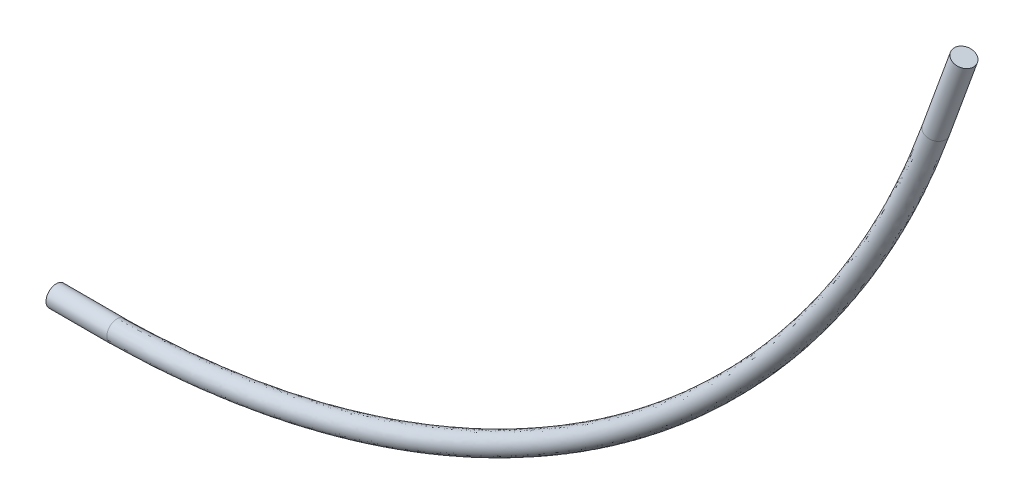
ISO-10303-21;
HEADER;
FILE_DESCRIPTION(('STEP AP214'),'2;1');
FILE_NAME('part.step','',(''),(''),'','','');
FILE_SCHEMA(('AUTOMOTIVE_DESIGN { 1 0 10303 214 1 1 1 1 }'));
ENDSEC;
DATA;
#1=APPLICATION_CONTEXT('core data for automotive mechanical design processes');
#2=APPLICATION_PROTOCOL_DEFINITION('international standard','automotive_design',2000,#1);
#3=PRODUCT_CONTEXT('',#1,'mechanical');
#4=PRODUCT('Part','Part','',(#3));
#5=PRODUCT_RELATED_PRODUCT_CATEGORY('part','',(#4));
#6=PRODUCT_DEFINITION_FORMATION('','',#4);
#7=PRODUCT_DEFINITION_CONTEXT('part definition',#1,'design');
#8=PRODUCT_DEFINITION('design','',#6,#7);
#9=PRODUCT_DEFINITION_SHAPE('','',#8);
#10=(LENGTH_UNIT() NAMED_UNIT(*) SI_UNIT(.MILLI.,.METRE.));
#11=(NAMED_UNIT(*) PLANE_ANGLE_UNIT() SI_UNIT($,.RADIAN.));
#12=(NAMED_UNIT(*) SI_UNIT($,.STERADIAN.) SOLID_ANGLE_UNIT());
#13=UNCERTAINTY_MEASURE_WITH_UNIT(LENGTH_MEASURE(1.E-05),#10,'distance_accuracy_value','');
#14=(GEOMETRIC_REPRESENTATION_CONTEXT(3) GLOBAL_UNCERTAINTY_ASSIGNED_CONTEXT((#13)) GLOBAL_UNIT_ASSIGNED_CONTEXT((#10,
#11,#12)) REPRESENTATION_CONTEXT('',''));
#15=CARTESIAN_POINT('',(0.,0.,0.));
#16=DIRECTION('',(0.,0.,1.));
#17=DIRECTION('',(1.,0.,0.));
#18=AXIS2_PLACEMENT_3D('',#15,#16,#17);
#19=CARTESIAN_POINT('',(0.,0.,0.));
#20=DIRECTION('',(1.,0.,0.));
#21=DIRECTION('',(0.,0.,-1.));
#22=AXIS2_PLACEMENT_3D('',#19,#20,#21);
#23=PLANE('',#22);
#24=CARTESIAN_POINT('',(0.,0.,0.));
#25=DIRECTION('',(1.,0.,0.));
#26=DIRECTION('',(0.,0.,-1.));
#27=AXIS2_PLACEMENT_3D('',#24,#25,#26);
#28=CIRCLE('',#27,3.175);
#29=CARTESIAN_POINT('',(0.,0.,-3.175));
#30=VERTEX_POINT('',#29);
#31=EDGE_CURVE('E48',#30,#30,#28,.T.);
#32=ORIENTED_EDGE('',*,*,#31,.F.);
#33=EDGE_LOOP('',(#32));
#34=FACE_BOUND('',#33,.T.);
#35=ADVANCED_FACE('F35',(#34),#23,.F.);
#36=CARTESIAN_POINT('',(280.994977572228,204.375656359263,0.));
#37=DIRECTION('',(0.342020143325666,0.939692620785909,0.));
#38=DIRECTION('',(0.,0.,-1.));
#39=AXIS2_PLACEMENT_3D('',#36,#37,#38);
#40=PLANE('',#39);
#41=CARTESIAN_POINT('',(280.994977572228,204.375656359263,0.));
#42=DIRECTION('',(0.342020143325666,0.939692620785909,0.));
#43=DIRECTION('',(0.,0.,-1.));
#44=AXIS2_PLACEMENT_3D('',#41,#42,#43);
#45=CIRCLE('',#44,3.175);
#46=CARTESIAN_POINT('',(280.994977572228,204.375656359263,-3.175));
#47=VERTEX_POINT('',#46);
#48=EDGE_CURVE('E53',#47,#47,#45,.T.);
#49=ORIENTED_EDGE('',*,*,#48,.T.);
#50=EDGE_LOOP('',(#49));
#51=FACE_BOUND('',#50,.T.);
#52=ADVANCED_FACE('F90',(#51),#40,.T.);
#53=CARTESIAN_POINT('',(19.25,0.,0.));
#54=DIRECTION('',(-1.,0.,0.));
#55=DIRECTION('',(0.,-1.,0.));
#56=AXIS2_PLACEMENT_3D('',#53,#54,#55);
#57=CYLINDRICAL_SURFACE('',#56,3.175);
#58=ORIENTED_EDGE('',*,*,#31,.T.);
#59=EDGE_LOOP('',(#58));
#60=FACE_BOUND('',#59,.T.);
#61=CARTESIAN_POINT('',(18.8500279655135,-0.00334446158616642,0.));
#62=DIRECTION('',(0.999860172432862,0.0167223079306566,0.));
#63=DIRECTION('',(0.,0.,-1.));
#64=AXIS2_PLACEMENT_3D('',#61,#62,#63);
#65=CIRCLE('',#64,3.175);
#66=CARTESIAN_POINT('',(18.8500279655101,-0.00334446076155695,-3.17499941283916));
#67=VERTEX_POINT('',#66);
#68=EDGE_CURVE('E11',#67,#67,#65,.T.);
#69=ORIENTED_EDGE('',*,*,#68,.F.);
#70=EDGE_LOOP('',(#69));
#71=FACE_BOUND('',#70,.T.);
#72=ADVANCED_FACE('F82',(#60,#71),#57,.T.);
#73=CARTESIAN_POINT('',(280.994977572228,204.375656359263,0.));
#74=DIRECTION('',(-0.342020143325667,-0.939692620785909,0.));
#75=DIRECTION('',(0.939692620785909,-0.342020143325667,0.));
#76=AXIS2_PLACEMENT_3D('',#73,#74,#75);
#77=CYLINDRICAL_SURFACE('',#76,3.175);
#78=CARTESIAN_POINT('',(272.307665931757,180.507463791301,0.));
#79=DIRECTION('',(0.342020143325666,0.939692620785909,0.));
#80=DIRECTION('',(0.,0.,-1.));
#81=AXIS2_PLACEMENT_3D('',#78,#79,#80);
#82=CIRCLE('',#81,3.175);
#83=CARTESIAN_POINT('',(272.307665931757,180.507463791301,-3.175));
#84=VERTEX_POINT('',#83);
#85=EDGE_CURVE('E43',#84,#84,#82,.T.);
#86=ORIENTED_EDGE('',*,*,#85,.T.);
#87=EDGE_LOOP('',(#86));
#88=FACE_BOUND('',#87,.T.);
#89=ORIENTED_EDGE('',*,*,#48,.F.);
#90=EDGE_LOOP('',(#89));
#91=FACE_BOUND('',#90,.T.);
#92=ADVANCED_FACE('F81',(#88,#91),#77,.T.);
#93=CARTESIAN_POINT('',(272.307665931757,180.507463791301,-3.175));
#94=CARTESIAN_POINT('',(271.718666285876,178.889200564178,-3.175));
#95=CARTESIAN_POINT('',(271.114436661159,177.276495968376,-3.175));
#96=CARTESIAN_POINT('',(269.8757261064,174.062757795169,-3.175));
#97=CARTESIAN_POINT('',(269.241245170677,172.461724255552,-3.175));
#98=CARTESIAN_POINT('',(267.292756021953,167.676963702438,-3.175));
#99=CARTESIAN_POINT('',(265.933695507858,164.511577066203,-3.175));
#100=CARTESIAN_POINT('',(261.679169841282,155.095452835661,-3.175));
#101=CARTESIAN_POINT('',(258.606270377996,148.924783875201,-3.175));
#102=CARTESIAN_POINT('',(248.704152788701,130.785793029956,-3.175));
#103=CARTESIAN_POINT('',(241.190587340439,119.191751591583,-3.175));
#104=CARTESIAN_POINT('',(216.167252314814,86.2968605469632,-3.175));
#105=CARTESIAN_POINT('',(196.159338149794,66.901537100209,-3.175));
#106=CARTESIAN_POINT('',(151.283516085206,34.916638255658,-3.175));
#107=CARTESIAN_POINT('',(126.421741378737,22.3314342488983,-3.175));
#108=CARTESIAN_POINT('',(87.1627638109094,9.40959879121987,-3.175));
#109=CARTESIAN_POINT('',(73.7521876208226,6.08992762666343,-3.175));
#110=CARTESIAN_POINT('',(53.3754325710943,2.64765481169502,-3.175));
#111=CARTESIAN_POINT('',(46.5399185328455,1.75611896661112,-3.175));
#112=CARTESIAN_POINT('',(36.250847929869,0.806450722854175,-3.175));
#113=CARTESIAN_POINT('',(32.8151915620155,0.554476958328467,-3.175));
#114=CARTESIAN_POINT('',(27.6563633259304,0.273657823456547,-3.175));
#115=CARTESIAN_POINT('',(25.9358628942269,0.196240288026011,-3.175));
#116=CARTESIAN_POINT('',(22.4936746473334,0.0738111957894119,-3.175));
#117=CARTESIAN_POINT('',(20.7719868362972,0.0288011904348096,-3.175));
#118=CARTESIAN_POINT('',(18.9833426562944,-0.0011148812578258,-3.175));
#119=CARTESIAN_POINT('',(18.9166853103423,-0.00222964105745817,-3.175));
#120=CARTESIAN_POINT('',(18.8500279655135,-0.00334446158616642,-3.175));
#121=CARTESIAN_POINT('',(266.340617789766,182.679291701419,-3.175));
#122=CARTESIAN_POINT('',(265.758433426905,181.079753310498,-3.175));
#123=CARTESIAN_POINT('',(265.175002101774,179.523094586055,-3.175));
#124=CARTESIAN_POINT('',(263.964957652553,176.383728393732,-3.175));
#125=CARTESIAN_POINT('',(263.345159805972,174.819745798949,-3.175));
#126=CARTESIAN_POINT('',(261.441762382144,170.145713656556,-3.175));
#127=CARTESIAN_POINT('',(260.114153099334,167.053580055174,-3.175));
#128=CARTESIAN_POINT('',(255.958085205188,157.855362752104,-3.175));
#129=CARTESIAN_POINT('',(252.9562984486,151.827494744718,-3.175));
#130=CARTESIAN_POINT('',(243.283334592407,134.108274461815,-3.175));
#131=CARTESIAN_POINT('',(235.943647262351,122.782541075218,-3.175));
#132=CARTESIAN_POINT('',(211.49939954691,90.6489000378737,-3.175));
#133=CARTESIAN_POINT('',(191.954506365599,71.7024210665132,-3.175));
#134=CARTESIAN_POINT('',(148.117195716271,40.4577132882775,-3.175));
#135=CARTESIAN_POINT('',(123.830769508819,28.1637547101178,-3.175));
#136=CARTESIAN_POINT('',(85.480318949474,15.5409549696522,-3.175));
#137=CARTESIAN_POINT('',(72.3800888617454,12.2981072757832,-3.175));
#138=CARTESIAN_POINT('',(52.4748904713406,8.93549516563612,-3.175));
#139=CARTESIAN_POINT('',(45.7975631589156,8.06459114655272,-3.175));
#140=CARTESIAN_POINT('',(35.7466011139349,7.13690002248507,-3.175));
#141=CARTESIAN_POINT('',(32.3904523337838,6.89075740753601,-3.175));
#142=CARTESIAN_POINT('',(27.3510091422307,6.61643695868206,-3.175));
#143=CARTESIAN_POINT('',(25.6703243452519,6.54081101147464,-3.175));
#144=CARTESIAN_POINT('',(22.3077948461061,6.42121516003618,-3.175));
#145=CARTESIAN_POINT('',(20.6458751648049,6.37758001021325,-3.175));
#146=CARTESIAN_POINT('',(18.8779272894374,6.34801011462429,-3.175));
#147=CARTESIAN_POINT('',(18.8104986549826,6.34688245389121,-3.175));
#148=CARTESIAN_POINT('',(18.7438413101539,6.34576763336251,-3.175));
#149=CARTESIAN_POINT('',(266.340617789766,182.679291701419,3.175));
#150=CARTESIAN_POINT('',(265.758433426905,181.079753310498,3.175));
#151=CARTESIAN_POINT('',(265.175002101774,179.523094586055,3.175));
#152=CARTESIAN_POINT('',(263.964957652553,176.383728393732,3.175));
#153=CARTESIAN_POINT('',(263.345159805972,174.819745798949,3.175));
#154=CARTESIAN_POINT('',(261.441762382144,170.145713656556,3.175));
#155=CARTESIAN_POINT('',(260.114153099334,167.053580055174,3.175));
#156=CARTESIAN_POINT('',(255.958085205188,157.855362752104,3.175));
#157=CARTESIAN_POINT('',(252.9562984486,151.827494744718,3.175));
#158=CARTESIAN_POINT('',(243.283334592407,134.108274461815,3.175));
#159=CARTESIAN_POINT('',(235.943647262351,122.782541075218,3.175));
#160=CARTESIAN_POINT('',(211.49939954691,90.6489000378737,3.175));
#161=CARTESIAN_POINT('',(191.954506365599,71.7024210665132,3.175));
#162=CARTESIAN_POINT('',(148.117195716271,40.4577132882775,3.175));
#163=CARTESIAN_POINT('',(123.830769508819,28.1637547101178,3.175));
#164=CARTESIAN_POINT('',(85.480318949474,15.5409549696522,3.175));
#165=CARTESIAN_POINT('',(72.3800888617454,12.2981072757832,3.175));
#166=CARTESIAN_POINT('',(52.4748904713406,8.93549516563612,3.175));
#167=CARTESIAN_POINT('',(45.7975631589156,8.06459114655272,3.175));
#168=CARTESIAN_POINT('',(35.7466011139349,7.13690002248507,3.175));
#169=CARTESIAN_POINT('',(32.3904523337838,6.89075740753601,3.175));
#170=CARTESIAN_POINT('',(27.3510091422307,6.61643695868206,3.175));
#171=CARTESIAN_POINT('',(25.6703243452519,6.54081101147464,3.175));
#172=CARTESIAN_POINT('',(22.3077948461061,6.42121516003618,3.175));
#173=CARTESIAN_POINT('',(20.6458751648049,6.37758001021325,3.175));
#174=CARTESIAN_POINT('',(18.8779272894374,6.34801011462429,3.175));
#175=CARTESIAN_POINT('',(18.8104986549826,6.34688245389121,3.175));
#176=CARTESIAN_POINT('',(18.7438413101539,6.34576763336251,3.175));
#177=CARTESIAN_POINT('',(272.307665931757,180.507463791301,3.175));
#178=CARTESIAN_POINT('',(271.718666285876,178.889200564178,3.175));
#179=CARTESIAN_POINT('',(271.114436661159,177.276495968376,3.175));
#180=CARTESIAN_POINT('',(269.8757261064,174.062757795169,3.175));
#181=CARTESIAN_POINT('',(269.241245170677,172.461724255552,3.175));
#182=CARTESIAN_POINT('',(267.292756021953,167.676963702438,3.175));
#183=CARTESIAN_POINT('',(265.933695507858,164.511577066203,3.175));
#184=CARTESIAN_POINT('',(261.679169841282,155.095452835661,3.175));
#185=CARTESIAN_POINT('',(258.606270377996,148.924783875201,3.175));
#186=CARTESIAN_POINT('',(248.704152788701,130.785793029956,3.175));
#187=CARTESIAN_POINT('',(241.190587340439,119.191751591583,3.175));
#188=CARTESIAN_POINT('',(216.167252314814,86.2968605469632,3.175));
#189=CARTESIAN_POINT('',(196.159338149794,66.901537100209,3.175));
#190=CARTESIAN_POINT('',(151.283516085206,34.916638255658,3.175));
#191=CARTESIAN_POINT('',(126.421741378737,22.3314342488983,3.175));
#192=CARTESIAN_POINT('',(87.1627638109094,9.40959879121987,3.175));
#193=CARTESIAN_POINT('',(73.7521876208226,6.08992762666343,3.175));
#194=CARTESIAN_POINT('',(53.3754325710943,2.64765481169503,3.175));
#195=CARTESIAN_POINT('',(46.5399185328455,1.75611896661112,3.175));
#196=CARTESIAN_POINT('',(36.250847929869,0.806450722854175,3.175));
#197=CARTESIAN_POINT('',(32.8151915620155,0.554476958328468,3.175));
#198=CARTESIAN_POINT('',(27.6563633259304,0.273657823456547,3.175));
#199=CARTESIAN_POINT('',(25.9358628942269,0.196240288026011,3.175));
#200=CARTESIAN_POINT('',(22.4936746473334,0.0738111957894123,3.175));
#201=CARTESIAN_POINT('',(20.7719868362972,0.02880119043481,3.175));
#202=CARTESIAN_POINT('',(18.9833426562944,-0.00111488125782541,3.175));
#203=CARTESIAN_POINT('',(18.9166853103423,-0.00222964105745778,3.175));
#204=CARTESIAN_POINT('',(18.8500279655135,-0.00334446158616603,3.175));
#205=CARTESIAN_POINT('',(278.274714073747,178.335635881183,3.175));
#206=CARTESIAN_POINT('',(277.678899144847,176.698647817857,3.175));
#207=CARTESIAN_POINT('',(277.053871220545,175.029897350698,3.175));
#208=CARTESIAN_POINT('',(275.786494560248,171.741787196605,3.175));
#209=CARTESIAN_POINT('',(275.137330535383,170.103702712156,3.175));
#210=CARTESIAN_POINT('',(273.143749661761,165.208213748319,3.175));
#211=CARTESIAN_POINT('',(271.753237916382,161.969574077232,3.175));
#212=CARTESIAN_POINT('',(267.400254477376,152.335542919218,3.175));
#213=CARTESIAN_POINT('',(264.256242307391,146.022073005683,3.175));
#214=CARTESIAN_POINT('',(254.124970984996,127.463311598098,3.175));
#215=CARTESIAN_POINT('',(246.437527418527,115.600962107948,3.175));
#216=CARTESIAN_POINT('',(220.835105082717,81.9448210560527,3.175));
#217=CARTESIAN_POINT('',(200.364169933989,62.1006531339049,3.175));
#218=CARTESIAN_POINT('',(154.44983645414,29.3755632230385,3.175));
#219=CARTESIAN_POINT('',(129.012713248655,16.4991137876789,3.175));
#220=CARTESIAN_POINT('',(88.8452086723447,3.27824261278752,3.175));
#221=CARTESIAN_POINT('',(75.1242863798998,-0.118252022456297,3.175));
#222=CARTESIAN_POINT('',(54.275974670848,-3.64018554224607,3.175));
#223=CARTESIAN_POINT('',(47.2822739067755,-4.55235321333049,3.175));
#224=CARTESIAN_POINT('',(36.7550947458031,-5.52399857677672,3.175));
#225=CARTESIAN_POINT('',(33.2399307902472,-5.78180349087907,3.175));
#226=CARTESIAN_POINT('',(27.9617175096302,-6.06912131176896,3.175));
#227=CARTESIAN_POINT('',(26.201401443202,-6.14833043542261,3.175));
#228=CARTESIAN_POINT('',(22.6795544485607,-6.27359276845735,3.175));
#229=CARTESIAN_POINT('',(20.8980985077895,-6.31997762934363,3.175));
#230=CARTESIAN_POINT('',(19.0887580231513,-6.35023987713994,3.175));
#231=CARTESIAN_POINT('',(19.022871965702,-6.35134173600613,3.175));
#232=CARTESIAN_POINT('',(18.9562146208732,-6.35245655653484,3.175));
#233=CARTESIAN_POINT('',(278.274714073747,178.335635881183,-3.175));
#234=CARTESIAN_POINT('',(277.678899144847,176.698647817857,-3.175));
#235=CARTESIAN_POINT('',(277.053871220545,175.029897350698,-3.175));
#236=CARTESIAN_POINT('',(275.786494560248,171.741787196605,-3.175));
#237=CARTESIAN_POINT('',(275.137330535383,170.103702712156,-3.175));
#238=CARTESIAN_POINT('',(273.143749661761,165.208213748319,-3.175));
#239=CARTESIAN_POINT('',(271.753237916382,161.969574077232,-3.175));
#240=CARTESIAN_POINT('',(267.400254477376,152.335542919218,-3.175));
#241=CARTESIAN_POINT('',(264.256242307391,146.022073005683,-3.175));
#242=CARTESIAN_POINT('',(254.124970984996,127.463311598098,-3.175));
#243=CARTESIAN_POINT('',(246.437527418527,115.600962107948,-3.175));
#244=CARTESIAN_POINT('',(220.835105082717,81.9448210560527,-3.175));
#245=CARTESIAN_POINT('',(200.364169933989,62.1006531339049,-3.175));
#246=CARTESIAN_POINT('',(154.44983645414,29.3755632230385,-3.175));
#247=CARTESIAN_POINT('',(129.012713248655,16.4991137876789,-3.175));
#248=CARTESIAN_POINT('',(88.8452086723447,3.27824261278752,-3.175));
#249=CARTESIAN_POINT('',(75.1242863798998,-0.118252022456297,-3.175));
#250=CARTESIAN_POINT('',(54.275974670848,-3.64018554224607,-3.175));
#251=CARTESIAN_POINT('',(47.2822739067755,-4.55235321333049,-3.175));
#252=CARTESIAN_POINT('',(36.7550947458031,-5.52399857677672,-3.175));
#253=CARTESIAN_POINT('',(33.2399307902472,-5.78180349087907,-3.175));
#254=CARTESIAN_POINT('',(27.9617175096302,-6.06912131176896,-3.175));
#255=CARTESIAN_POINT('',(26.201401443202,-6.14833043542261,-3.175));
#256=CARTESIAN_POINT('',(22.6795544485607,-6.27359276845735,-3.175));
#257=CARTESIAN_POINT('',(20.8980985077895,-6.31997762934363,-3.175));
#258=CARTESIAN_POINT('',(19.0887580231513,-6.35023987713994,-3.175));
#259=CARTESIAN_POINT('',(19.022871965702,-6.35134173600613,-3.175));
#260=CARTESIAN_POINT('',(18.9562146208732,-6.35245655653484,-3.175));
#261=CARTESIAN_POINT('',(272.307665931757,180.507463791301,-3.175));
#262=CARTESIAN_POINT('',(271.718666285876,178.889200564178,-3.175));
#263=CARTESIAN_POINT('',(271.114436661159,177.276495968376,-3.175));
#264=CARTESIAN_POINT('',(269.8757261064,174.062757795169,-3.175));
#265=CARTESIAN_POINT('',(269.241245170677,172.461724255552,-3.175));
#266=CARTESIAN_POINT('',(267.292756021953,167.676963702438,-3.175));
#267=CARTESIAN_POINT('',(265.933695507858,164.511577066203,-3.175));
#268=CARTESIAN_POINT('',(261.679169841282,155.095452835661,-3.175));
#269=CARTESIAN_POINT('',(258.606270377996,148.924783875201,-3.175));
#270=CARTESIAN_POINT('',(248.704152788701,130.785793029956,-3.175));
#271=CARTESIAN_POINT('',(241.190587340439,119.191751591583,-3.175));
#272=CARTESIAN_POINT('',(216.167252314814,86.2968605469632,-3.175));
#273=CARTESIAN_POINT('',(196.159338149794,66.901537100209,-3.175));
#274=CARTESIAN_POINT('',(151.283516085206,34.916638255658,-3.175));
#275=CARTESIAN_POINT('',(126.421741378737,22.3314342488983,-3.175));
#276=CARTESIAN_POINT('',(87.1627638109094,9.40959879121987,-3.175));
#277=CARTESIAN_POINT('',(73.7521876208226,6.08992762666343,-3.175));
#278=CARTESIAN_POINT('',(53.3754325710943,2.64765481169502,-3.175));
#279=CARTESIAN_POINT('',(46.5399185328455,1.75611896661112,-3.175));
#280=CARTESIAN_POINT('',(36.250847929869,0.806450722854175,-3.175));
#281=CARTESIAN_POINT('',(32.8151915620155,0.554476958328467,-3.175));
#282=CARTESIAN_POINT('',(27.6563633259304,0.273657823456547,-3.175));
#283=CARTESIAN_POINT('',(25.9358628942269,0.196240288026011,-3.175));
#284=CARTESIAN_POINT('',(22.4936746473334,0.0738111957894119,-3.175));
#285=CARTESIAN_POINT('',(20.7719868362972,0.0288011904348096,-3.175));
#286=CARTESIAN_POINT('',(18.9833426562944,-0.0011148812578258,-3.175));
#287=CARTESIAN_POINT('',(18.9166853103423,-0.00222964105745817,-3.175));
#288=CARTESIAN_POINT('',(18.8500279655135,-0.00334446158616642,-3.175));
#289=(BOUNDED_SURFACE() B_SPLINE_SURFACE(3,3,((#93,#94,#95,#96,#97,#98,#99,#100,#101,#102,#103,
#104,#105,#106,#107,#108,#109,#110,#111,#112,#113,#114,#115,#116,#117,#118,#119,#120),(#121,
#122,#123,#124,#125,#126,#127,#128,#129,#130,#131,#132,#133,#134,#135,#136,#137,#138,#139,#140,
#141,#142,#143,#144,#145,#146,#147,#148),(#149,#150,#151,#152,#153,#154,#155,#156,#157,#158,
#159,#160,#161,#162,#163,#164,#165,#166,#167,#168,#169,#170,#171,#172,#173,#174,#175,#176),
(#177,#178,#179,#180,#181,#182,#183,#184,#185,#186,#187,#188,#189,#190,#191,#192,#193,#194,#195,
#196,#197,#198,#199,#200,#201,#202,#203,#204),(#205,#206,#207,#208,#209,#210,#211,#212,#213,
#214,#215,#216,#217,#218,#219,#220,#221,#222,#223,#224,#225,#226,#227,#228,#229,#230,#231,#232),
(#233,#234,#235,#236,#237,#238,#239,#240,#241,#242,#243,#244,#245,#246,#247,#248,#249,#250,#251,
#252,#253,#254,#255,#256,#257,#258,#259,#260),(#261,#262,#263,#264,#265,#266,#267,#268,#269,
#270,#271,#272,#273,#274,#275,#276,#277,#278,#279,#280,#281,#282,#283,#284,#285,#286,#287,
#288)),.UNSPECIFIED.,.T.,.F.,.F.) B_SPLINE_SURFACE_WITH_KNOTS((4,3,4),(4,2,2,2,2,2,2,2,2,2,2,2,
2,4),(0.,0.5,1.),(0.0713388976291008,0.0858492273536461,0.100359557078191,0.129380216527282,
0.187421535425463,0.303504173221826,0.53566944881455,0.767834724407275,0.883917362203638,
0.941958681101819,0.970979340550909,0.985489670275455,1.,1.00056168840281),
.UNSPECIFIED.) GEOMETRIC_REPRESENTATION_ITEM() RATIONAL_B_SPLINE_SURFACE(((1.,1.,1.,1.,1.,1.,1.,
1.,1.,1.,1.,1.,1.,1.,1.,1.,1.,1.,1.,1.,1.,1.,1.,1.,1.,1.,1.,1.),(0.333333333333333,
0.333333333333333,0.333333333333333,0.333333333333333,0.333333333333333,0.333333333333333,
0.333333333333333,0.333333333333333,0.333333333333333,0.333333333333333,0.333333333333333,
0.333333333333333,0.333333333333333,0.333333333333333,0.333333333333333,0.333333333333333,
0.333333333333333,0.333333333333333,0.333333333333333,0.333333333333333,0.333333333333333,
0.333333333333333,0.333333333333333,0.333333333333333,0.333333333333333,0.333333333333333,
0.333333333333333,0.333333333333333),(0.333333333333333,0.333333333333333,0.333333333333333,
0.333333333333333,0.333333333333333,0.333333333333333,0.333333333333333,0.333333333333333,
0.333333333333333,0.333333333333333,0.333333333333333,0.333333333333333,0.333333333333333,
0.333333333333333,0.333333333333333,0.333333333333333,0.333333333333333,0.333333333333333,
0.333333333333333,0.333333333333333,0.333333333333333,0.333333333333333,0.333333333333333,
0.333333333333333,0.333333333333333,0.333333333333333,0.333333333333333,0.333333333333333),(1.,
1.,1.,1.,1.,1.,1.,1.,1.,1.,1.,1.,1.,1.,1.,1.,1.,1.,1.,1.,1.,1.,1.,1.,1.,1.,1.,1.),
(0.333333333333333,0.333333333333333,0.333333333333333,0.333333333333333,0.333333333333333,
0.333333333333333,0.333333333333333,0.333333333333333,0.333333333333333,0.333333333333333,
0.333333333333333,0.333333333333333,0.333333333333333,0.333333333333333,0.333333333333333,
0.333333333333333,0.333333333333333,0.333333333333333,0.333333333333333,0.333333333333333,
0.333333333333333,0.333333333333333,0.333333333333333,0.333333333333333,0.333333333333333,
0.333333333333333,0.333333333333333,0.333333333333333),(0.333333333333333,0.333333333333333,
0.333333333333333,0.333333333333333,0.333333333333333,0.333333333333333,0.333333333333333,
0.333333333333333,0.333333333333333,0.333333333333333,0.333333333333333,0.333333333333333,
0.333333333333333,0.333333333333333,0.333333333333333,0.333333333333333,0.333333333333333,
0.333333333333333,0.333333333333333,0.333333333333333,0.333333333333333,0.333333333333333,
0.333333333333333,0.333333333333333,0.333333333333333,0.333333333333333,0.333333333333333,
0.333333333333333),(1.,1.,1.,1.,1.,1.,1.,1.,1.,1.,1.,1.,1.,1.,1.,1.,1.,1.,1.,1.,1.,1.,1.,1.,1.,
1.,1.,1.))) REPRESENTATION_ITEM('') SURFACE());
#290=ORIENTED_EDGE('',*,*,#68,.T.);
#291=EDGE_LOOP('',(#290));
#292=FACE_BOUND('',#291,.T.);
#293=ORIENTED_EDGE('',*,*,#85,.F.);
#294=EDGE_LOOP('',(#293));
#295=FACE_BOUND('',#294,.T.);
#296=ADVANCED_FACE('F58',(#292,#295),#289,.F.);
#297=CLOSED_SHELL('',(#35,#52,#72,#92,#296));
#298=MANIFOLD_SOLID_BREP('B2',#297);
#299=ADVANCED_BREP_SHAPE_REPRESENTATION('',(#18,#298),#14);
#300=SHAPE_DEFINITION_REPRESENTATION(#9,#299);
ENDSEC;
END-ISO-10303-21;
